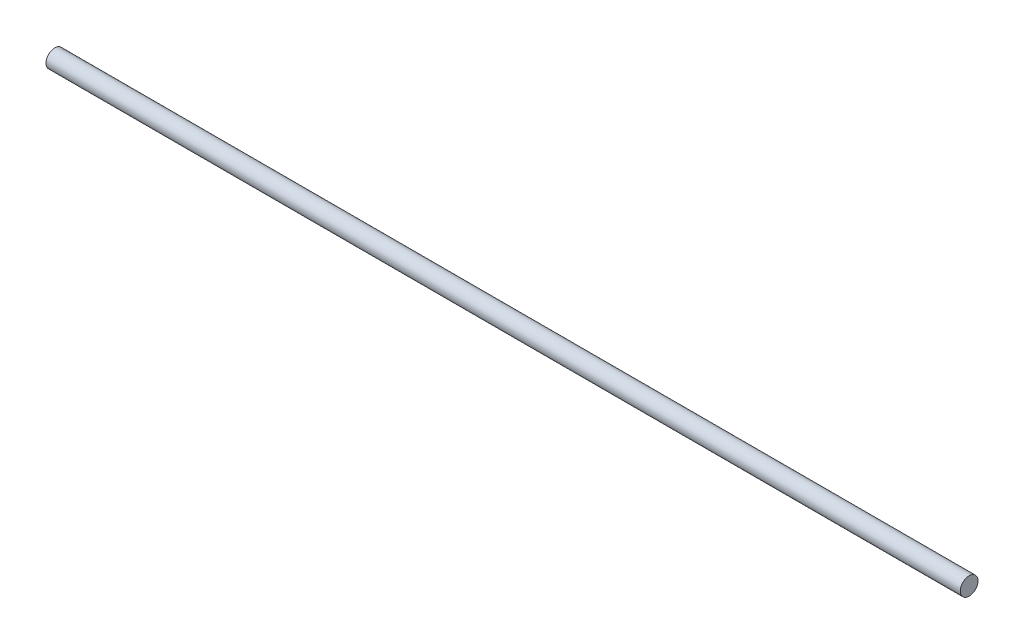
ISO-10303-21;
HEADER;
FILE_DESCRIPTION(('STEP AP214'),'2;1');
FILE_NAME('part.step','',(''),(''),'','','');
FILE_SCHEMA(('AUTOMOTIVE_DESIGN { 1 0 10303 214 1 1 1 1 }'));
ENDSEC;
DATA;
#1=APPLICATION_CONTEXT('core data for automotive mechanical design processes');
#2=APPLICATION_PROTOCOL_DEFINITION('international standard','automotive_design',2000,#1);
#3=PRODUCT_CONTEXT('',#1,'mechanical');
#4=PRODUCT('Part','Part','',(#3));
#5=PRODUCT_RELATED_PRODUCT_CATEGORY('part','',(#4));
#6=PRODUCT_DEFINITION_FORMATION('','',#4);
#7=PRODUCT_DEFINITION_CONTEXT('part definition',#1,'design');
#8=PRODUCT_DEFINITION('design','',#6,#7);
#9=PRODUCT_DEFINITION_SHAPE('','',#8);
#10=(LENGTH_UNIT() NAMED_UNIT(*) SI_UNIT(.MILLI.,.METRE.));
#11=(NAMED_UNIT(*) PLANE_ANGLE_UNIT() SI_UNIT($,.RADIAN.));
#12=(NAMED_UNIT(*) SI_UNIT($,.STERADIAN.) SOLID_ANGLE_UNIT());
#13=UNCERTAINTY_MEASURE_WITH_UNIT(LENGTH_MEASURE(1.E-05),#10,'distance_accuracy_value','');
#14=(GEOMETRIC_REPRESENTATION_CONTEXT(3) GLOBAL_UNCERTAINTY_ASSIGNED_CONTEXT((#13)) GLOBAL_UNIT_ASSIGNED_CONTEXT((#10,
#11,#12)) REPRESENTATION_CONTEXT('',''));
#15=CARTESIAN_POINT('',(0.,0.,0.));
#16=DIRECTION('',(0.,0.,1.));
#17=DIRECTION('',(1.,0.,0.));
#18=AXIS2_PLACEMENT_3D('',#15,#16,#17);
#19=CARTESIAN_POINT('',(310.,0.,0.));
#20=DIRECTION('',(-1.,0.,0.));
#21=DIRECTION('',(0.,0.,1.));
#22=AXIS2_PLACEMENT_3D('',#19,#20,#21);
#23=CYLINDRICAL_SURFACE('',#22,6.);
#24=CARTESIAN_POINT('',(310.,0.,0.));
#25=DIRECTION('',(1.,0.,0.));
#26=DIRECTION('',(0.,0.,-1.));
#27=AXIS2_PLACEMENT_3D('',#24,#25,#26);
#28=CIRCLE('',#27,6.);
#29=CARTESIAN_POINT('',(310.,0.,-6.));
#30=VERTEX_POINT('',#29);
#31=EDGE_CURVE('E10',#30,#30,#28,.T.);
#32=ORIENTED_EDGE('',*,*,#31,.F.);
#33=EDGE_LOOP('',(#32));
#34=FACE_BOUND('',#33,.T.);
#35=CARTESIAN_POINT('',(-310.,0.,0.));
#36=DIRECTION('',(1.,0.,0.));
#37=DIRECTION('',(0.,0.,-1.));
#38=AXIS2_PLACEMENT_3D('',#35,#36,#37);
#39=CIRCLE('',#38,6.);
#40=CARTESIAN_POINT('',(-310.,0.,-6.));
#41=VERTEX_POINT('',#40);
#42=EDGE_CURVE('E33',#41,#41,#39,.T.);
#43=ORIENTED_EDGE('',*,*,#42,.T.);
#44=EDGE_LOOP('',(#43));
#45=FACE_BOUND('',#44,.T.);
#46=ADVANCED_FACE('F30',(#34,#45),#23,.T.);
#47=CARTESIAN_POINT('',(310.,0.,0.));
#48=DIRECTION('',(1.,0.,0.));
#49=DIRECTION('',(0.,0.,-1.));
#50=AXIS2_PLACEMENT_3D('',#47,#48,#49);
#51=PLANE('',#50);
#52=ORIENTED_EDGE('',*,*,#31,.T.);
#53=EDGE_LOOP('',(#52));
#54=FACE_BOUND('',#53,.T.);
#55=ADVANCED_FACE('F45',(#54),#51,.T.);
#56=CARTESIAN_POINT('',(-310.,0.,0.));
#57=DIRECTION('',(1.,0.,0.));
#58=DIRECTION('',(0.,0.,-1.));
#59=AXIS2_PLACEMENT_3D('',#56,#57,#58);
#60=PLANE('',#59);
#61=ORIENTED_EDGE('',*,*,#42,.F.);
#62=EDGE_LOOP('',(#61));
#63=FACE_BOUND('',#62,.T.);
#64=ADVANCED_FACE('F43',(#63),#60,.F.);
#65=CLOSED_SHELL('',(#46,#55,#64));
#66=MANIFOLD_SOLID_BREP('B2',#65);
#67=ADVANCED_BREP_SHAPE_REPRESENTATION('',(#18,#66),#14);
#68=SHAPE_DEFINITION_REPRESENTATION(#9,#67);
ENDSEC;
END-ISO-10303-21;
